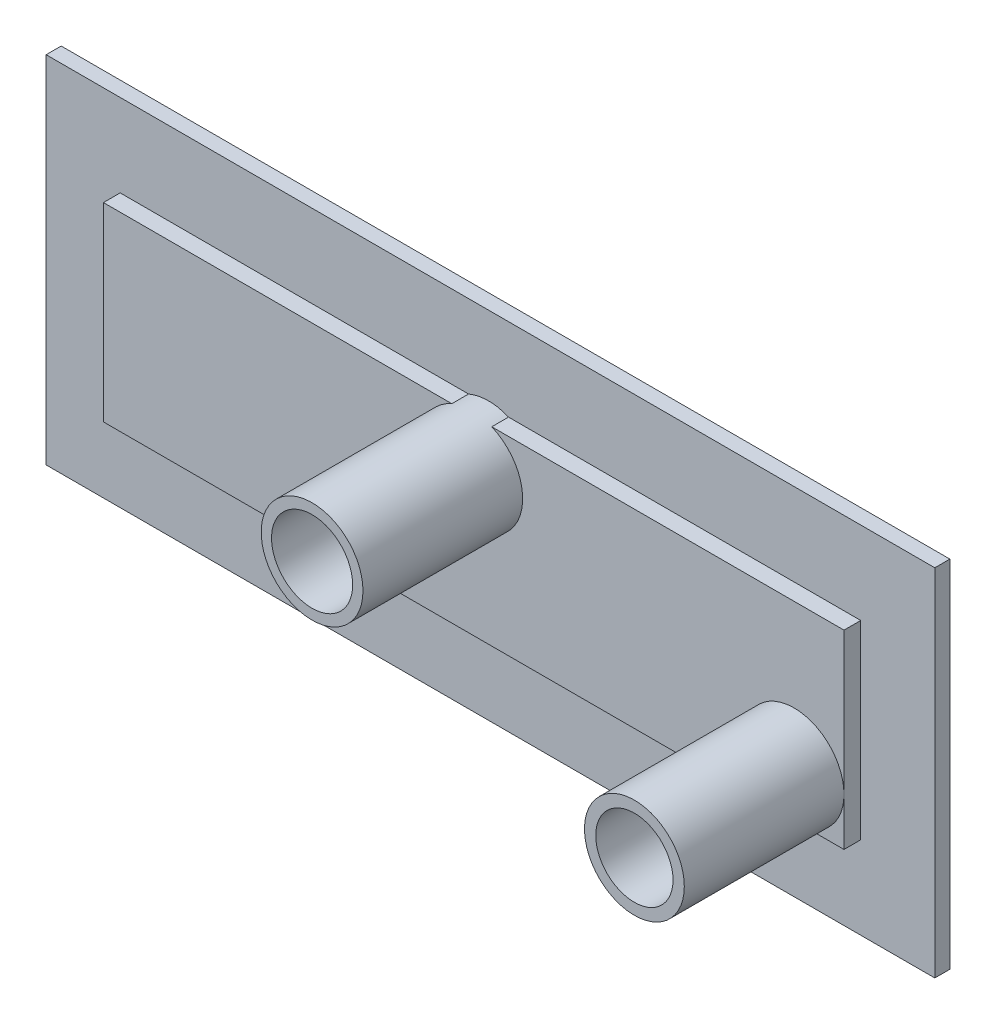
ISO-10303-21;
HEADER;
FILE_DESCRIPTION(('STEP AP214'),'2;1');
FILE_NAME('part.step','',(''),(''),'','','');
FILE_SCHEMA(('AUTOMOTIVE_DESIGN { 1 0 10303 214 1 1 1 1 }'));
ENDSEC;
DATA;
#1=APPLICATION_CONTEXT('core data for automotive mechanical design processes');
#2=APPLICATION_PROTOCOL_DEFINITION('international standard','automotive_design',2000,#1);
#3=PRODUCT_CONTEXT('',#1,'mechanical');
#4=PRODUCT('Part','Part','',(#3));
#5=PRODUCT_RELATED_PRODUCT_CATEGORY('part','',(#4));
#6=PRODUCT_DEFINITION_FORMATION('','',#4);
#7=PRODUCT_DEFINITION_CONTEXT('part definition',#1,'design');
#8=PRODUCT_DEFINITION('design','',#6,#7);
#9=PRODUCT_DEFINITION_SHAPE('','',#8);
#10=(LENGTH_UNIT() NAMED_UNIT(*) SI_UNIT(.MILLI.,.METRE.));
#11=(NAMED_UNIT(*) PLANE_ANGLE_UNIT() SI_UNIT($,.RADIAN.));
#12=(NAMED_UNIT(*) SI_UNIT($,.STERADIAN.) SOLID_ANGLE_UNIT());
#13=UNCERTAINTY_MEASURE_WITH_UNIT(LENGTH_MEASURE(1.E-05),#10,'distance_accuracy_value','');
#14=(GEOMETRIC_REPRESENTATION_CONTEXT(3) GLOBAL_UNCERTAINTY_ASSIGNED_CONTEXT((#13)) GLOBAL_UNIT_ASSIGNED_CONTEXT((#10,
#11,#12)) REPRESENTATION_CONTEXT('',''));
#15=CARTESIAN_POINT('',(0.,0.,0.));
#16=DIRECTION('',(0.,0.,1.));
#17=DIRECTION('',(1.,0.,0.));
#18=AXIS2_PLACEMENT_3D('',#15,#16,#17);
#19=CARTESIAN_POINT('',(0.,-18.7325,6.2738));
#20=DIRECTION('',(0.,1.,0.));
#21=DIRECTION('',(0.,0.,1.));
#22=AXIS2_PLACEMENT_3D('',#19,#20,#21);
#23=PLANE('',#22);
#24=DIRECTION('',(0.,0.,-1.));
#25=VECTOR('',#24,1.);
#26=CARTESIAN_POINT('',(66.0450121043412,-18.7325,37.7698));
#27=LINE('',#26,#25);
#28=CARTESIAN_POINT('',(66.0450121043412,-18.7325,2.9718));
#29=VERTEX_POINT('',#28);
#30=CARTESIAN_POINT('',(66.0450121043412,-18.7325,6.2738));
#31=VERTEX_POINT('',#30);
#32=EDGE_CURVE('E157',#29,#31,#27,.F.);
#33=ORIENTED_EDGE('',*,*,#32,.F.);
#34=DIRECTION('',(1.,0.,0.));
#35=VECTOR('',#34,1.);
#36=CARTESIAN_POINT('',(0.,-18.7325,2.9718));
#37=LINE('',#36,#35);
#38=CARTESIAN_POINT('',(73.025,-18.7325,2.9718));
#39=VERTEX_POINT('',#38);
#40=EDGE_CURVE('E168',#29,#39,#37,.T.);
#41=ORIENTED_EDGE('',*,*,#40,.T.);
#42=DIRECTION('',(0.,0.,-1.));
#43=VECTOR('',#42,1.);
#44=CARTESIAN_POINT('',(73.025,-18.7325,6.2738));
#45=LINE('',#44,#43);
#46=CARTESIAN_POINT('',(73.025,-18.7325,6.2738));
#47=VERTEX_POINT('',#46);
#48=EDGE_CURVE('E182',#47,#39,#45,.T.);
#49=ORIENTED_EDGE('',*,*,#48,.F.);
#50=DIRECTION('',(1.,0.,0.));
#51=VECTOR('',#50,1.);
#52=CARTESIAN_POINT('',(-73.025,-18.7325,6.2738));
#53=LINE('',#52,#51);
#54=EDGE_CURVE('E294',#31,#47,#53,.T.);
#55=ORIENTED_EDGE('',*,*,#54,.F.);
#56=EDGE_LOOP('',(#33,#41,#49,#55));
#57=FACE_BOUND('',#56,.T.);
#58=ADVANCED_FACE('F34',(#57),#23,.F.);
#59=DIRECTION('',(0.,0.,-1.));
#60=VECTOR('',#59,1.);
#61=CARTESIAN_POINT('',(60.3199878956588,-18.7325,37.7698));
#62=LINE('',#61,#60);
#63=CARTESIAN_POINT('',(60.3199878956588,-18.7325,6.2738));
#64=VERTEX_POINT('',#63);
#65=CARTESIAN_POINT('',(60.3199878956588,-18.7325,2.9718));
#66=VERTEX_POINT('',#65);
#67=EDGE_CURVE('E148',#64,#66,#62,.T.);
#68=ORIENTED_EDGE('',*,*,#67,.F.);
#69=CARTESIAN_POINT('',(-73.025,-18.7325,6.2738));
#70=VERTEX_POINT('',#69);
#71=EDGE_CURVE('E185',#70,#64,#53,.T.);
#72=ORIENTED_EDGE('',*,*,#71,.F.);
#73=DIRECTION('',(0.,0.,-1.));
#74=VECTOR('',#73,1.);
#75=CARTESIAN_POINT('',(-73.025,-18.7325,6.2738));
#76=LINE('',#75,#74);
#77=CARTESIAN_POINT('',(-73.025,-18.7325,2.9718));
#78=VERTEX_POINT('',#77);
#79=EDGE_CURVE('E173',#70,#78,#76,.T.);
#80=ORIENTED_EDGE('',*,*,#79,.T.);
#81=EDGE_CURVE('E165',#78,#66,#37,.T.);
#82=ORIENTED_EDGE('',*,*,#81,.T.);
#83=EDGE_LOOP('',(#68,#72,#80,#82));
#84=FACE_BOUND('',#83,.T.);
#85=ADVANCED_FACE('F171',(#84),#23,.F.);
#86=CARTESIAN_POINT('',(0.,0.,6.2738));
#87=DIRECTION('',(0.,0.,1.));
#88=DIRECTION('',(1.,0.,0.));
#89=AXIS2_PLACEMENT_3D('',#86,#87,#88);
#90=PLANE('',#89);
#91=DIRECTION('',(0.,1.,0.));
#92=VECTOR('',#91,1.);
#93=CARTESIAN_POINT('',(73.025,18.7325,6.2738));
#94=LINE('',#93,#92);
#95=CARTESIAN_POINT('',(73.025,-9.31545,6.2738));
#96=VERTEX_POINT('',#95);
#97=EDGE_CURVE('E285',#47,#96,#94,.T.);
#98=ORIENTED_EDGE('',*,*,#97,.T.);
#99=CARTESIAN_POINT('',(63.1825,-9.31545,6.2738));
#100=DIRECTION('',(0.,0.,1.));
#101=DIRECTION('',(1.,0.,0.));
#102=AXIS2_PLACEMENT_3D('',#99,#100,#101);
#103=CIRCLE('',#102,9.84249999999999);
#104=EDGE_CURVE('E11',#96,#31,#103,.F.);
#105=ORIENTED_EDGE('',*,*,#104,.T.);
#106=ORIENTED_EDGE('',*,*,#54,.T.);
#107=EDGE_LOOP('',(#98,#105,#106));
#108=FACE_BOUND('',#107,.T.);
#109=ADVANCED_FACE('F323',(#108),#90,.T.);
#110=CARTESIAN_POINT('',(-73.025,18.7325,6.2738));
#111=DIRECTION('',(0.,-1.,0.));
#112=DIRECTION('',(1.,0.,0.));
#113=AXIS2_PLACEMENT_3D('',#110,#111,#112);
#114=PLANE('',#113);
#115=DIRECTION('',(0.,0.,-1.));
#116=VECTOR('',#115,1.);
#117=CARTESIAN_POINT('',(-4.32204860379829,18.7325,37.7698));
#118=LINE('',#117,#116);
#119=CARTESIAN_POINT('',(-4.32204860379828,18.7325,2.9718));
#120=VERTEX_POINT('',#119);
#121=CARTESIAN_POINT('',(-4.32204860379828,18.7325,6.2738));
#122=VERTEX_POINT('',#121);
#123=EDGE_CURVE('E57',#120,#122,#118,.F.);
#124=ORIENTED_EDGE('',*,*,#123,.F.);
#125=DIRECTION('',(-1.,0.,0.));
#126=VECTOR('',#125,1.);
#127=CARTESIAN_POINT('',(-73.025,18.7325,2.9718));
#128=LINE('',#127,#126);
#129=CARTESIAN_POINT('',(-73.025,18.7325,2.9718));
#130=VERTEX_POINT('',#129);
#131=EDGE_CURVE('E284',#120,#130,#128,.T.);
#132=ORIENTED_EDGE('',*,*,#131,.T.);
#133=DIRECTION('',(0.,0.,-1.));
#134=VECTOR('',#133,1.);
#135=CARTESIAN_POINT('',(-73.025,18.7325,6.2738));
#136=LINE('',#135,#134);
#137=CARTESIAN_POINT('',(-73.025,18.7325,6.2738));
#138=VERTEX_POINT('',#137);
#139=EDGE_CURVE('E187',#138,#130,#136,.T.);
#140=ORIENTED_EDGE('',*,*,#139,.F.);
#141=DIRECTION('',(-1.,0.,0.));
#142=VECTOR('',#141,1.);
#143=CARTESIAN_POINT('',(-73.025,18.7325,6.2738));
#144=LINE('',#143,#142);
#145=EDGE_CURVE('E288',#122,#138,#144,.T.);
#146=ORIENTED_EDGE('',*,*,#145,.F.);
#147=EDGE_LOOP('',(#124,#132,#140,#146));
#148=FACE_BOUND('',#147,.T.);
#149=ADVANCED_FACE('F303',(#148),#114,.F.);
#150=DIRECTION('',(0.,0.,-1.));
#151=VECTOR('',#150,1.);
#152=CARTESIAN_POINT('',(3.5600486037983,18.7325,37.7698));
#153=LINE('',#152,#151);
#154=CARTESIAN_POINT('',(3.5600486037983,18.7325,6.2738));
#155=VERTEX_POINT('',#154);
#156=CARTESIAN_POINT('',(3.5600486037983,18.7325,2.9718));
#157=VERTEX_POINT('',#156);
#158=EDGE_CURVE('E247',#155,#157,#153,.T.);
#159=ORIENTED_EDGE('',*,*,#158,.F.);
#160=CARTESIAN_POINT('',(73.025,18.7325,6.2738));
#161=VERTEX_POINT('',#160);
#162=EDGE_CURVE('E289',#161,#155,#144,.T.);
#163=ORIENTED_EDGE('',*,*,#162,.F.);
#164=DIRECTION('',(0.,0.,-1.));
#165=VECTOR('',#164,1.);
#166=CARTESIAN_POINT('',(73.025,18.7325,6.2738));
#167=LINE('',#166,#165);
#168=CARTESIAN_POINT('',(73.025,18.7325,2.9718));
#169=VERTEX_POINT('',#168);
#170=EDGE_CURVE('E190',#161,#169,#167,.T.);
#171=ORIENTED_EDGE('',*,*,#170,.T.);
#172=EDGE_CURVE('E295',#169,#157,#128,.T.);
#173=ORIENTED_EDGE('',*,*,#172,.T.);
#174=EDGE_LOOP('',(#159,#163,#171,#173));
#175=FACE_BOUND('',#174,.T.);
#176=ADVANCED_FACE('F313',(#175),#114,.F.);
#177=CARTESIAN_POINT('',(0.,0.,2.9718));
#178=DIRECTION('',(0.,0.,-1.));
#179=DIRECTION('',(-1.,0.,0.));
#180=AXIS2_PLACEMENT_3D('',#177,#178,#179);
#181=PLANE('',#180);
#182=CARTESIAN_POINT('',(63.1825,-9.31545,2.9718));
#183=DIRECTION('',(0.,0.,1.));
#184=DIRECTION('',(1.,0.,0.));
#185=AXIS2_PLACEMENT_3D('',#182,#183,#184);
#186=CIRCLE('',#185,9.84249999999999);
#187=EDGE_CURVE('E151',#66,#29,#186,.T.);
#188=ORIENTED_EDGE('',*,*,#187,.F.);
#189=ORIENTED_EDGE('',*,*,#81,.F.);
#190=DIRECTION('',(0.,-1.,0.));
#191=VECTOR('',#190,1.);
#192=CARTESIAN_POINT('',(-73.025,0.,2.9718));
#193=LINE('',#192,#191);
#194=EDGE_CURVE('E178',#130,#78,#193,.T.);
#195=ORIENTED_EDGE('',*,*,#194,.F.);
#196=ORIENTED_EDGE('',*,*,#131,.F.);
#197=CARTESIAN_POINT('',(-0.380999999999992,9.50595000000004,2.9718));
#198=DIRECTION('',(0.,0.,1.));
#199=DIRECTION('',(1.,0.,0.));
#200=AXIS2_PLACEMENT_3D('',#197,#198,#199);
#201=CIRCLE('',#200,10.033);
#202=EDGE_CURVE('E243',#157,#120,#201,.T.);
#203=ORIENTED_EDGE('',*,*,#202,.F.);
#204=ORIENTED_EDGE('',*,*,#172,.F.);
#205=DIRECTION('',(0.,1.,0.));
#206=VECTOR('',#205,1.);
#207=CARTESIAN_POINT('',(73.025,0.,2.9718));
#208=LINE('',#207,#206);
#209=EDGE_CURVE('E174',#39,#169,#208,.T.);
#210=ORIENTED_EDGE('',*,*,#209,.F.);
#211=ORIENTED_EDGE('',*,*,#40,.F.);
#212=EDGE_LOOP('',(#188,#189,#195,#196,#203,#204,#210,#211));
#213=FACE_BOUND('',#212,.T.);
#214=DIRECTION('',(0.,-1.,0.));
#215=VECTOR('',#214,1.);
#216=CARTESIAN_POINT('',(-87.63,-35.03295,2.9718));
#217=LINE('',#216,#215);
#218=CARTESIAN_POINT('',(-87.63,35.03295,2.9718));
#219=VERTEX_POINT('',#218);
#220=CARTESIAN_POINT('',(-87.63,-35.03295,2.9718));
#221=VERTEX_POINT('',#220);
#222=EDGE_CURVE('E194',#219,#221,#217,.T.);
#223=ORIENTED_EDGE('',*,*,#222,.T.);
#224=DIRECTION('',(1.,0.,0.));
#225=VECTOR('',#224,1.);
#226=CARTESIAN_POINT('',(0.,-35.03295,2.9718));
#227=LINE('',#226,#225);
#228=CARTESIAN_POINT('',(87.63,-35.03295,2.9718));
#229=VERTEX_POINT('',#228);
#230=EDGE_CURVE('E197',#221,#229,#227,.T.);
#231=ORIENTED_EDGE('',*,*,#230,.T.);
#232=DIRECTION('',(0.,1.,0.));
#233=VECTOR('',#232,1.);
#234=CARTESIAN_POINT('',(87.63,0.,2.9718));
#235=LINE('',#234,#233);
#236=CARTESIAN_POINT('',(87.63,35.03295,2.9718));
#237=VERTEX_POINT('',#236);
#238=EDGE_CURVE('E200',#229,#237,#235,.T.);
#239=ORIENTED_EDGE('',*,*,#238,.T.);
#240=DIRECTION('',(-1.,0.,0.));
#241=VECTOR('',#240,1.);
#242=CARTESIAN_POINT('',(-87.63,35.03295,2.9718));
#243=LINE('',#242,#241);
#244=EDGE_CURVE('E202',#237,#219,#243,.T.);
#245=ORIENTED_EDGE('',*,*,#244,.T.);
#246=EDGE_LOOP('',(#223,#231,#239,#245));
#247=FACE_BOUND('',#246,.T.);
#248=ADVANCED_FACE('F162',(#213,#247),#181,.F.);
#249=CARTESIAN_POINT('',(87.63,-35.03295,2.9718));
#250=DIRECTION('',(0.,1.,0.));
#251=DIRECTION('',(0.,0.,1.));
#252=AXIS2_PLACEMENT_3D('',#249,#250,#251);
#253=PLANE('',#252);
#254=DIRECTION('',(1.,0.,0.));
#255=VECTOR('',#254,1.);
#256=CARTESIAN_POINT('',(87.63,-35.03295,0.));
#257=LINE('',#256,#255);
#258=CARTESIAN_POINT('',(-87.63,-35.03295,0.));
#259=VERTEX_POINT('',#258);
#260=CARTESIAN_POINT('',(87.63,-35.03295,0.));
#261=VERTEX_POINT('',#260);
#262=EDGE_CURVE('E193',#259,#261,#257,.T.);
#263=ORIENTED_EDGE('',*,*,#262,.T.);
#264=DIRECTION('',(0.,0.,-1.));
#265=VECTOR('',#264,1.);
#266=CARTESIAN_POINT('',(87.63,-35.03295,2.9718));
#267=LINE('',#266,#265);
#268=EDGE_CURVE('E219',#229,#261,#267,.T.);
#269=ORIENTED_EDGE('',*,*,#268,.F.);
#270=ORIENTED_EDGE('',*,*,#230,.F.);
#271=DIRECTION('',(0.,0.,-1.));
#272=VECTOR('',#271,1.);
#273=CARTESIAN_POINT('',(-87.63,-35.03295,2.9718));
#274=LINE('',#273,#272);
#275=EDGE_CURVE('E222',#221,#259,#274,.T.);
#276=ORIENTED_EDGE('',*,*,#275,.T.);
#277=EDGE_LOOP('',(#263,#269,#270,#276));
#278=FACE_BOUND('',#277,.T.);
#279=ADVANCED_FACE('F36',(#278),#253,.F.);
#280=CARTESIAN_POINT('',(87.63,35.03295,2.9718));
#281=DIRECTION('',(-1.,0.,0.));
#282=DIRECTION('',(0.,0.,1.));
#283=AXIS2_PLACEMENT_3D('',#280,#281,#282);
#284=PLANE('',#283);
#285=DIRECTION('',(0.,1.,0.));
#286=VECTOR('',#285,1.);
#287=CARTESIAN_POINT('',(87.63,35.03295,0.));
#288=LINE('',#287,#286);
#289=CARTESIAN_POINT('',(87.63,35.03295,0.));
#290=VERTEX_POINT('',#289);
#291=EDGE_CURVE('E208',#261,#290,#288,.T.);
#292=ORIENTED_EDGE('',*,*,#291,.T.);
#293=DIRECTION('',(0.,0.,-1.));
#294=VECTOR('',#293,1.);
#295=CARTESIAN_POINT('',(87.63,35.03295,2.9718));
#296=LINE('',#295,#294);
#297=EDGE_CURVE('E216',#237,#290,#296,.T.);
#298=ORIENTED_EDGE('',*,*,#297,.F.);
#299=ORIENTED_EDGE('',*,*,#238,.F.);
#300=ORIENTED_EDGE('',*,*,#268,.T.);
#301=EDGE_LOOP('',(#292,#298,#299,#300));
#302=FACE_BOUND('',#301,.T.);
#303=ADVANCED_FACE('F354',(#302),#284,.F.);
#304=CARTESIAN_POINT('',(-87.63,35.03295,2.9718));
#305=DIRECTION('',(0.,-1.,0.));
#306=DIRECTION('',(1.,0.,0.));
#307=AXIS2_PLACEMENT_3D('',#304,#305,#306);
#308=PLANE('',#307);
#309=DIRECTION('',(-1.,0.,0.));
#310=VECTOR('',#309,1.);
#311=CARTESIAN_POINT('',(-87.63,35.03295,0.));
#312=LINE('',#311,#310);
#313=CARTESIAN_POINT('',(-87.63,35.03295,0.));
#314=VERTEX_POINT('',#313);
#315=EDGE_CURVE('E210',#290,#314,#312,.T.);
#316=ORIENTED_EDGE('',*,*,#315,.T.);
#317=DIRECTION('',(0.,0.,-1.));
#318=VECTOR('',#317,1.);
#319=CARTESIAN_POINT('',(-87.63,35.03295,2.9718));
#320=LINE('',#319,#318);
#321=EDGE_CURVE('E205',#219,#314,#320,.T.);
#322=ORIENTED_EDGE('',*,*,#321,.F.);
#323=ORIENTED_EDGE('',*,*,#244,.F.);
#324=ORIENTED_EDGE('',*,*,#297,.T.);
#325=EDGE_LOOP('',(#316,#322,#323,#324));
#326=FACE_BOUND('',#325,.T.);
#327=ADVANCED_FACE('F351',(#326),#308,.F.);
#328=CARTESIAN_POINT('',(-87.63,35.03295,2.9718));
#329=DIRECTION('',(1.,0.,0.));
#330=DIRECTION('',(0.,0.,-1.));
#331=AXIS2_PLACEMENT_3D('',#328,#329,#330);
#332=PLANE('',#331);
#333=DIRECTION('',(0.,-1.,0.));
#334=VECTOR('',#333,1.);
#335=CARTESIAN_POINT('',(-87.63,35.03295,0.));
#336=LINE('',#335,#334);
#337=EDGE_CURVE('E198',#314,#259,#336,.T.);
#338=ORIENTED_EDGE('',*,*,#337,.T.);
#339=ORIENTED_EDGE('',*,*,#275,.F.);
#340=ORIENTED_EDGE('',*,*,#222,.F.);
#341=ORIENTED_EDGE('',*,*,#321,.T.);
#342=EDGE_LOOP('',(#338,#339,#340,#341));
#343=FACE_BOUND('',#342,.T.);
#344=ADVANCED_FACE('F347',(#343),#332,.F.);
#345=CARTESIAN_POINT('',(0.,0.,0.));
#346=DIRECTION('',(0.,0.,-1.));
#347=DIRECTION('',(-1.,0.,0.));
#348=AXIS2_PLACEMENT_3D('',#345,#346,#347);
#349=PLANE('',#348);
#350=DIRECTION('',(1.,0.,0.));
#351=VECTOR('',#350,1.);
#352=CARTESIAN_POINT('',(75.438,21.209,0.));
#353=LINE('',#352,#351);
#354=CARTESIAN_POINT('',(-75.438,21.209,0.));
#355=VERTEX_POINT('',#354);
#356=CARTESIAN_POINT('',(75.438,21.209,0.));
#357=VERTEX_POINT('',#356);
#358=EDGE_CURVE('E251',#355,#357,#353,.T.);
#359=ORIENTED_EDGE('',*,*,#358,.F.);
#360=DIRECTION('',(0.,1.,0.));
#361=VECTOR('',#360,1.);
#362=CARTESIAN_POINT('',(-75.438,0.,0.));
#363=LINE('',#362,#361);
#364=CARTESIAN_POINT('',(-75.438,-21.209,0.));
#365=VERTEX_POINT('',#364);
#366=EDGE_CURVE('E256',#365,#355,#363,.T.);
#367=ORIENTED_EDGE('',*,*,#366,.F.);
#368=DIRECTION('',(-1.,0.,0.));
#369=VECTOR('',#368,1.);
#370=CARTESIAN_POINT('',(-75.438,-21.209,0.));
#371=LINE('',#370,#369);
#372=CARTESIAN_POINT('',(75.438,-21.209,0.));
#373=VERTEX_POINT('',#372);
#374=EDGE_CURVE('E268',#373,#365,#371,.T.);
#375=ORIENTED_EDGE('',*,*,#374,.F.);
#376=DIRECTION('',(0.,-1.,0.));
#377=VECTOR('',#376,1.);
#378=CARTESIAN_POINT('',(75.438,-21.209,0.));
#379=LINE('',#378,#377);
#380=EDGE_CURVE('E265',#357,#373,#379,.T.);
#381=ORIENTED_EDGE('',*,*,#380,.F.);
#382=EDGE_LOOP('',(#359,#367,#375,#381));
#383=FACE_BOUND('',#382,.T.);
#384=ORIENTED_EDGE('',*,*,#262,.F.);
#385=ORIENTED_EDGE('',*,*,#337,.F.);
#386=ORIENTED_EDGE('',*,*,#315,.F.);
#387=ORIENTED_EDGE('',*,*,#291,.F.);
#388=EDGE_LOOP('',(#384,#385,#386,#387));
#389=FACE_BOUND('',#388,.T.);
#390=ADVANCED_FACE('F341',(#383,#389),#349,.T.);
#391=CARTESIAN_POINT('',(-73.025,0.,6.2738));
#392=DIRECTION('',(1.,0.,0.));
#393=DIRECTION('',(0.,0.,-1.));
#394=AXIS2_PLACEMENT_3D('',#391,#392,#393);
#395=PLANE('',#394);
#396=ORIENTED_EDGE('',*,*,#194,.T.);
#397=ORIENTED_EDGE('',*,*,#79,.F.);
#398=DIRECTION('',(0.,-1.,0.));
#399=VECTOR('',#398,1.);
#400=CARTESIAN_POINT('',(-73.025,18.7325,6.2738));
#401=LINE('',#400,#399);
#402=EDGE_CURVE('E292',#138,#70,#401,.T.);
#403=ORIENTED_EDGE('',*,*,#402,.F.);
#404=ORIENTED_EDGE('',*,*,#139,.T.);
#405=EDGE_LOOP('',(#396,#397,#403,#404));
#406=FACE_BOUND('',#405,.T.);
#407=ADVANCED_FACE('F308',(#406),#395,.F.);
#408=CARTESIAN_POINT('',(73.025,0.,6.2738));
#409=DIRECTION('',(-1.,0.,0.));
#410=DIRECTION('',(0.,0.,1.));
#411=AXIS2_PLACEMENT_3D('',#408,#409,#410);
#412=PLANE('',#411);
#413=ORIENTED_EDGE('',*,*,#209,.T.);
#414=ORIENTED_EDGE('',*,*,#170,.F.);
#415=EDGE_CURVE('E176',#96,#161,#94,.T.);
#416=ORIENTED_EDGE('',*,*,#415,.F.);
#417=ORIENTED_EDGE('',*,*,#97,.F.);
#418=ORIENTED_EDGE('',*,*,#48,.T.);
#419=EDGE_LOOP('',(#413,#414,#416,#417,#418));
#420=FACE_BOUND('',#419,.T.);
#421=ADVANCED_FACE('F317',(#420),#412,.F.);
#422=ORIENTED_EDGE('',*,*,#71,.T.);
#423=EDGE_CURVE('E43',#64,#96,#103,.F.);
#424=ORIENTED_EDGE('',*,*,#423,.T.);
#425=ORIENTED_EDGE('',*,*,#415,.T.);
#426=ORIENTED_EDGE('',*,*,#162,.T.);
#427=CARTESIAN_POINT('',(-0.380999999999992,9.50595000000004,6.2738));
#428=DIRECTION('',(0.,0.,1.));
#429=DIRECTION('',(1.,0.,0.));
#430=AXIS2_PLACEMENT_3D('',#427,#428,#429);
#431=CIRCLE('',#430,10.033);
#432=EDGE_CURVE('E225',#155,#122,#431,.F.);
#433=ORIENTED_EDGE('',*,*,#432,.T.);
#434=ORIENTED_EDGE('',*,*,#145,.T.);
#435=ORIENTED_EDGE('',*,*,#402,.T.);
#436=EDGE_LOOP('',(#422,#424,#425,#426,#433,#434,#435));
#437=FACE_BOUND('',#436,.T.);
#438=ADVANCED_FACE('F310',(#437),#90,.T.);
#439=CARTESIAN_POINT('',(75.438,21.209,-10.668));
#440=DIRECTION('',(0.,-1.,0.));
#441=DIRECTION('',(1.,0.,0.));
#442=AXIS2_PLACEMENT_3D('',#439,#440,#441);
#443=PLANE('',#442);
#444=ORIENTED_EDGE('',*,*,#358,.T.);
#445=DIRECTION('',(0.,0.,1.));
#446=VECTOR('',#445,1.);
#447=CARTESIAN_POINT('',(75.438,21.209,-10.668));
#448=LINE('',#447,#446);
#449=CARTESIAN_POINT('',(75.438,21.209,-10.668));
#450=VERTEX_POINT('',#449);
#451=EDGE_CURVE('E278',#450,#357,#448,.T.);
#452=ORIENTED_EDGE('',*,*,#451,.F.);
#453=DIRECTION('',(1.,0.,0.));
#454=VECTOR('',#453,1.);
#455=CARTESIAN_POINT('',(75.438,21.209,-10.668));
#456=LINE('',#455,#454);
#457=CARTESIAN_POINT('',(-75.438,21.209,-10.668));
#458=VERTEX_POINT('',#457);
#459=EDGE_CURVE('E255',#458,#450,#456,.T.);
#460=ORIENTED_EDGE('',*,*,#459,.F.);
#461=DIRECTION('',(0.,0.,1.));
#462=VECTOR('',#461,1.);
#463=CARTESIAN_POINT('',(-75.438,21.209,-10.668));
#464=LINE('',#463,#462);
#465=EDGE_CURVE('E281',#458,#355,#464,.T.);
#466=ORIENTED_EDGE('',*,*,#465,.T.);
#467=EDGE_LOOP('',(#444,#452,#460,#466));
#468=FACE_BOUND('',#467,.T.);
#469=ADVANCED_FACE('F335',(#468),#443,.F.);
#470=CARTESIAN_POINT('',(75.438,-21.209,-10.668));
#471=DIRECTION('',(-1.,0.,0.));
#472=DIRECTION('',(0.,0.,1.));
#473=AXIS2_PLACEMENT_3D('',#470,#471,#472);
#474=PLANE('',#473);
#475=ORIENTED_EDGE('',*,*,#380,.T.);
#476=DIRECTION('',(0.,0.,1.));
#477=VECTOR('',#476,1.);
#478=CARTESIAN_POINT('',(75.438,-21.209,-10.668));
#479=LINE('',#478,#477);
#480=CARTESIAN_POINT('',(75.438,-21.209,-10.668));
#481=VERTEX_POINT('',#480);
#482=EDGE_CURVE('E275',#481,#373,#479,.T.);
#483=ORIENTED_EDGE('',*,*,#482,.F.);
#484=DIRECTION('',(0.,-1.,0.));
#485=VECTOR('',#484,1.);
#486=CARTESIAN_POINT('',(75.438,0.,-10.668));
#487=LINE('',#486,#485);
#488=EDGE_CURVE('E258',#450,#481,#487,.T.);
#489=ORIENTED_EDGE('',*,*,#488,.F.);
#490=ORIENTED_EDGE('',*,*,#451,.T.);
#491=EDGE_LOOP('',(#475,#483,#489,#490));
#492=FACE_BOUND('',#491,.T.);
#493=ADVANCED_FACE('F413',(#492),#474,.F.);
#494=CARTESIAN_POINT('',(-75.438,-21.209,-10.668));
#495=DIRECTION('',(0.,1.,0.));
#496=DIRECTION('',(0.,0.,1.));
#497=AXIS2_PLACEMENT_3D('',#494,#495,#496);
#498=PLANE('',#497);
#499=ORIENTED_EDGE('',*,*,#374,.T.);
#500=DIRECTION('',(0.,0.,1.));
#501=VECTOR('',#500,1.);
#502=CARTESIAN_POINT('',(-75.438,-21.209,-10.668));
#503=LINE('',#502,#501);
#504=CARTESIAN_POINT('',(-75.438,-21.209,-10.668));
#505=VERTEX_POINT('',#504);
#506=EDGE_CURVE('E262',#505,#365,#503,.T.);
#507=ORIENTED_EDGE('',*,*,#506,.F.);
#508=DIRECTION('',(-1.,0.,0.));
#509=VECTOR('',#508,1.);
#510=CARTESIAN_POINT('',(0.,-21.209,-10.668));
#511=LINE('',#510,#509);
#512=EDGE_CURVE('E260',#481,#505,#511,.T.);
#513=ORIENTED_EDGE('',*,*,#512,.F.);
#514=ORIENTED_EDGE('',*,*,#482,.T.);
#515=EDGE_LOOP('',(#499,#507,#513,#514));
#516=FACE_BOUND('',#515,.T.);
#517=ADVANCED_FACE('F400',(#516),#498,.F.);
#518=CARTESIAN_POINT('',(-75.438,0.,-10.668));
#519=DIRECTION('',(1.,0.,0.));
#520=DIRECTION('',(0.,0.,-1.));
#521=AXIS2_PLACEMENT_3D('',#518,#519,#520);
#522=PLANE('',#521);
#523=ORIENTED_EDGE('',*,*,#366,.T.);
#524=ORIENTED_EDGE('',*,*,#465,.F.);
#525=DIRECTION('',(0.,1.,0.));
#526=VECTOR('',#525,1.);
#527=CARTESIAN_POINT('',(-75.438,21.209,-10.668));
#528=LINE('',#527,#526);
#529=EDGE_CURVE('E252',#505,#458,#528,.T.);
#530=ORIENTED_EDGE('',*,*,#529,.F.);
#531=ORIENTED_EDGE('',*,*,#506,.T.);
#532=EDGE_LOOP('',(#523,#524,#530,#531));
#533=FACE_BOUND('',#532,.T.);
#534=ADVANCED_FACE('F394',(#533),#522,.F.);
#535=CARTESIAN_POINT('',(0.,0.,-10.668));
#536=DIRECTION('',(0.,0.,1.));
#537=DIRECTION('',(1.,0.,0.));
#538=AXIS2_PLACEMENT_3D('',#535,#536,#537);
#539=PLANE('',#538);
#540=CARTESIAN_POINT('',(63.1825,-9.31545,-10.668));
#541=DIRECTION('',(0.,0.,1.));
#542=DIRECTION('',(1.,0.,0.));
#543=AXIS2_PLACEMENT_3D('',#540,#541,#542);
#544=CIRCLE('',#543,7.62);
#545=CARTESIAN_POINT('',(70.8025,-9.31545,-10.668));
#546=VERTEX_POINT('',#545);
#547=EDGE_CURVE('E228',#546,#546,#544,.T.);
#548=ORIENTED_EDGE('',*,*,#547,.T.);
#549=EDGE_LOOP('',(#548));
#550=FACE_BOUND('',#549,.T.);
#551=CARTESIAN_POINT('',(-0.380999999999992,9.50595000000004,-10.668));
#552=DIRECTION('',(0.,0.,1.));
#553=DIRECTION('',(1.,0.,0.));
#554=AXIS2_PLACEMENT_3D('',#551,#552,#553);
#555=CIRCLE('',#554,8.001);
#556=CARTESIAN_POINT('',(7.62000000000001,9.50595000000004,-10.668));
#557=VERTEX_POINT('',#556);
#558=EDGE_CURVE('E233',#557,#557,#555,.T.);
#559=ORIENTED_EDGE('',*,*,#558,.T.);
#560=EDGE_LOOP('',(#559));
#561=FACE_BOUND('',#560,.T.);
#562=ORIENTED_EDGE('',*,*,#529,.T.);
#563=ORIENTED_EDGE('',*,*,#459,.T.);
#564=ORIENTED_EDGE('',*,*,#488,.T.);
#565=ORIENTED_EDGE('',*,*,#512,.T.);
#566=EDGE_LOOP('',(#562,#563,#564,#565));
#567=FACE_BOUND('',#566,.T.);
#568=ADVANCED_FACE('F399',(#550,#561,#567),#539,.F.);
#569=CARTESIAN_POINT('',(-0.380999999999992,9.50595000000004,37.7698));
#570=DIRECTION('',(0.,0.,-1.));
#571=DIRECTION('',(-1.,0.,0.));
#572=AXIS2_PLACEMENT_3D('',#569,#570,#571);
#573=CYLINDRICAL_SURFACE('',#572,10.033);
#574=CARTESIAN_POINT('',(-0.380999999999992,9.50595000000004,37.7698));
#575=DIRECTION('',(0.,0.,1.));
#576=DIRECTION('',(1.,0.,0.));
#577=AXIS2_PLACEMENT_3D('',#574,#575,#576);
#578=CIRCLE('',#577,10.033);
#579=CARTESIAN_POINT('',(9.65200000000001,9.50595000000004,37.7698));
#580=VERTEX_POINT('',#579);
#581=EDGE_CURVE('E244',#580,#580,#578,.T.);
#582=ORIENTED_EDGE('',*,*,#581,.F.);
#583=EDGE_LOOP('',(#582));
#584=FACE_BOUND('',#583,.T.);
#585=ORIENTED_EDGE('',*,*,#202,.T.);
#586=ORIENTED_EDGE('',*,*,#123,.T.);
#587=ORIENTED_EDGE('',*,*,#432,.F.);
#588=ORIENTED_EDGE('',*,*,#158,.T.);
#589=EDGE_LOOP('',(#585,#586,#587,#588));
#590=FACE_BOUND('',#589,.T.);
#591=ADVANCED_FACE('F312',(#584,#590),#573,.T.);
#592=CARTESIAN_POINT('',(-0.380999999999992,9.50595000000004,37.7698));
#593=DIRECTION('',(0.,0.,1.));
#594=DIRECTION('',(1.,0.,0.));
#595=AXIS2_PLACEMENT_3D('',#592,#593,#594);
#596=PLANE('',#595);
#597=CARTESIAN_POINT('',(-0.380999999999992,9.50595000000004,37.7698));
#598=DIRECTION('',(0.,0.,1.));
#599=DIRECTION('',(1.,0.,0.));
#600=AXIS2_PLACEMENT_3D('',#597,#598,#599);
#601=CIRCLE('',#600,8.001);
#602=CARTESIAN_POINT('',(7.62000000000001,9.50595000000004,37.7698));
#603=VERTEX_POINT('',#602);
#604=EDGE_CURVE('E38',#603,#603,#601,.T.);
#605=ORIENTED_EDGE('',*,*,#604,.F.);
#606=EDGE_LOOP('',(#605));
#607=FACE_BOUND('',#606,.T.);
#608=ORIENTED_EDGE('',*,*,#581,.T.);
#609=EDGE_LOOP('',(#608));
#610=FACE_BOUND('',#609,.T.);
#611=ADVANCED_FACE('F494',(#607,#610),#596,.T.);
#612=CARTESIAN_POINT('',(63.1825,-9.31545,37.7698));
#613=DIRECTION('',(0.,0.,-1.));
#614=DIRECTION('',(-1.,0.,0.));
#615=AXIS2_PLACEMENT_3D('',#612,#613,#614);
#616=CYLINDRICAL_SURFACE('',#615,9.84249999999999);
#617=CARTESIAN_POINT('',(63.1825,-9.31545,37.7698));
#618=DIRECTION('',(0.,0.,1.));
#619=DIRECTION('',(1.,0.,0.));
#620=AXIS2_PLACEMENT_3D('',#617,#618,#619);
#621=CIRCLE('',#620,9.84249999999999);
#622=CARTESIAN_POINT('',(73.025,-9.31545,37.7698));
#623=VERTEX_POINT('',#622);
#624=EDGE_CURVE('E158',#623,#623,#621,.T.);
#625=ORIENTED_EDGE('',*,*,#624,.F.);
#626=EDGE_LOOP('',(#625));
#627=FACE_BOUND('',#626,.T.);
#628=ORIENTED_EDGE('',*,*,#187,.T.);
#629=ORIENTED_EDGE('',*,*,#32,.T.);
#630=ORIENTED_EDGE('',*,*,#104,.F.);
#631=ORIENTED_EDGE('',*,*,#423,.F.);
#632=ORIENTED_EDGE('',*,*,#67,.T.);
#633=EDGE_LOOP('',(#628,#629,#630,#631,#632));
#634=FACE_BOUND('',#633,.T.);
#635=ADVANCED_FACE('F150',(#627,#634),#616,.T.);
#636=CARTESIAN_POINT('',(63.1825,-9.31545,37.7698));
#637=DIRECTION('',(0.,0.,1.));
#638=DIRECTION('',(1.,0.,0.));
#639=AXIS2_PLACEMENT_3D('',#636,#637,#638);
#640=PLANE('',#639);
#641=CARTESIAN_POINT('',(63.1825,-9.31545,37.7698));
#642=DIRECTION('',(0.,0.,1.));
#643=DIRECTION('',(1.,0.,0.));
#644=AXIS2_PLACEMENT_3D('',#641,#642,#643);
#645=CIRCLE('',#644,7.62);
#646=CARTESIAN_POINT('',(70.8025,-9.31545,37.7698));
#647=VERTEX_POINT('',#646);
#648=EDGE_CURVE('E226',#647,#647,#645,.T.);
#649=ORIENTED_EDGE('',*,*,#648,.F.);
#650=EDGE_LOOP('',(#649));
#651=FACE_BOUND('',#650,.T.);
#652=ORIENTED_EDGE('',*,*,#624,.T.);
#653=EDGE_LOOP('',(#652));
#654=FACE_BOUND('',#653,.T.);
#655=ADVANCED_FACE('F493',(#651,#654),#640,.T.);
#656=CARTESIAN_POINT('',(63.1825,-9.31545,-10.668));
#657=DIRECTION('',(0.,0.,1.));
#658=DIRECTION('',(1.,0.,0.));
#659=AXIS2_PLACEMENT_3D('',#656,#657,#658);
#660=CYLINDRICAL_SURFACE('',#659,7.62);
#661=ORIENTED_EDGE('',*,*,#648,.T.);
#662=EDGE_LOOP('',(#661));
#663=FACE_BOUND('',#662,.T.);
#664=ORIENTED_EDGE('',*,*,#547,.F.);
#665=EDGE_LOOP('',(#664));
#666=FACE_BOUND('',#665,.T.);
#667=ADVANCED_FACE('F522',(#663,#666),#660,.F.);
#668=CARTESIAN_POINT('',(-0.380999999999992,9.50595000000004,-10.668));
#669=DIRECTION('',(0.,0.,1.));
#670=DIRECTION('',(1.,0.,0.));
#671=AXIS2_PLACEMENT_3D('',#668,#669,#670);
#672=CYLINDRICAL_SURFACE('',#671,8.001);
#673=ORIENTED_EDGE('',*,*,#604,.T.);
#674=EDGE_LOOP('',(#673));
#675=FACE_BOUND('',#674,.T.);
#676=ORIENTED_EDGE('',*,*,#558,.F.);
#677=EDGE_LOOP('',(#676));
#678=FACE_BOUND('',#677,.T.);
#679=ADVANCED_FACE('F532',(#675,#678),#672,.F.);
#680=CLOSED_SHELL('',(#58,#85,#109,#149,#176,#248,#279,#303,#327,#344,#390,#407,#421,#438,#469,
#493,#517,#534,#568,#591,#611,#635,#655,#667,#679));
#681=MANIFOLD_SOLID_BREP('B2',#680);
#682=ADVANCED_BREP_SHAPE_REPRESENTATION('',(#18,#681),#14);
#683=SHAPE_DEFINITION_REPRESENTATION(#9,#682);
ENDSEC;
END-ISO-10303-21;
